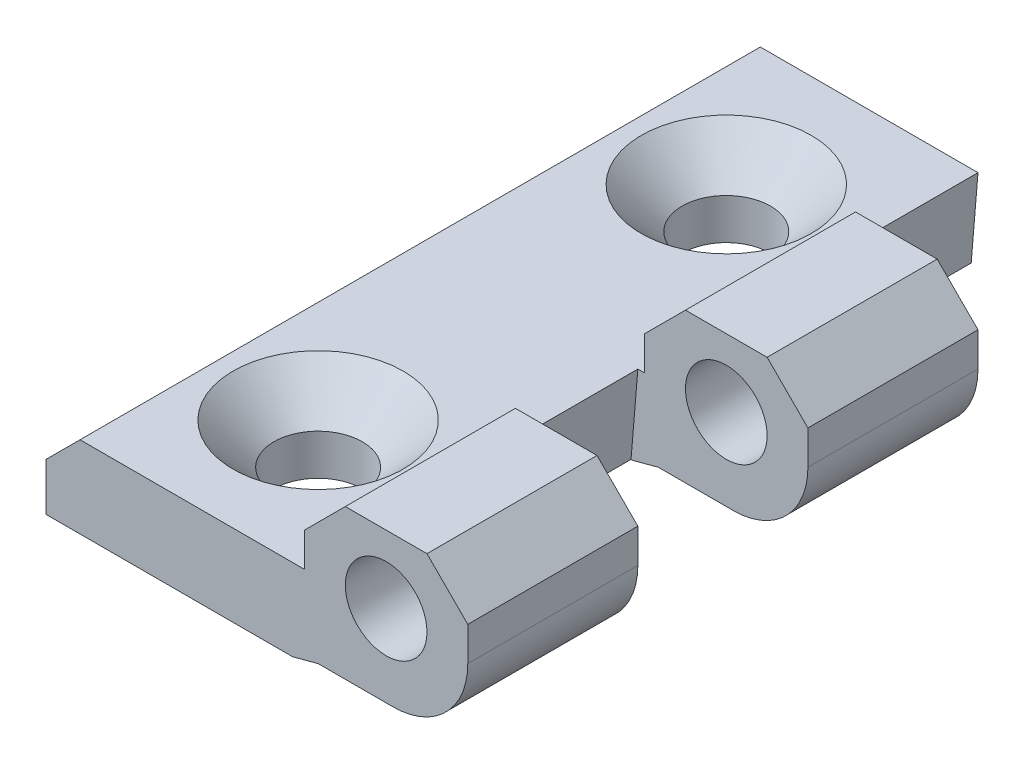
ISO-10303-21;
HEADER;
FILE_DESCRIPTION(('STEP AP214'),'2;1');
FILE_NAME('part.step','',(''),(''),'','','');
FILE_SCHEMA(('AUTOMOTIVE_DESIGN { 1 0 10303 214 1 1 1 1 }'));
ENDSEC;
DATA;
#1=APPLICATION_CONTEXT('core data for automotive mechanical design processes');
#2=APPLICATION_PROTOCOL_DEFINITION('international standard','automotive_design',2000,#1);
#3=PRODUCT_CONTEXT('',#1,'mechanical');
#4=PRODUCT('Part','Part','',(#3));
#5=PRODUCT_RELATED_PRODUCT_CATEGORY('part','',(#4));
#6=PRODUCT_DEFINITION_FORMATION('','',#4);
#7=PRODUCT_DEFINITION_CONTEXT('part definition',#1,'design');
#8=PRODUCT_DEFINITION('design','',#6,#7);
#9=PRODUCT_DEFINITION_SHAPE('','',#8);
#10=(LENGTH_UNIT() NAMED_UNIT(*) SI_UNIT(.MILLI.,.METRE.));
#11=(NAMED_UNIT(*) PLANE_ANGLE_UNIT() SI_UNIT($,.RADIAN.));
#12=(NAMED_UNIT(*) SI_UNIT($,.STERADIAN.) SOLID_ANGLE_UNIT());
#13=UNCERTAINTY_MEASURE_WITH_UNIT(LENGTH_MEASURE(1.E-05),#10,'distance_accuracy_value','');
#14=(GEOMETRIC_REPRESENTATION_CONTEXT(3) GLOBAL_UNCERTAINTY_ASSIGNED_CONTEXT((#13)) GLOBAL_UNIT_ASSIGNED_CONTEXT((#10,
#11,#12)) REPRESENTATION_CONTEXT('',''));
#15=CARTESIAN_POINT('',(0.,0.,0.));
#16=DIRECTION('',(0.,0.,1.));
#17=DIRECTION('',(1.,0.,0.));
#18=AXIS2_PLACEMENT_3D('',#15,#16,#17);
#19=CARTESIAN_POINT('',(-7.,0.,25.));
#20=DIRECTION('',(-0.99654575824488,0.0830454798537399,0.));
#21=DIRECTION('',(-0.0830454798537399,-0.99654575824488,0.));
#22=AXIS2_PLACEMENT_3D('',#19,#20,#21);
#23=PLANE('',#22);
#24=DIRECTION('',(0.08304547985374,0.99654575824488,0.));
#25=VECTOR('',#24,1.);
#26=CARTESIAN_POINT('',(-7.,0.,12.5));
#27=LINE('',#26,#25);
#28=CARTESIAN_POINT('',(-7.,0.,12.5));
#29=VERTEX_POINT('',#28);
#30=CARTESIAN_POINT('',(-6.5,6.,12.5));
#31=VERTEX_POINT('',#30);
#32=EDGE_CURVE('E207',#29,#31,#27,.T.);
#33=ORIENTED_EDGE('',*,*,#32,.F.);
#34=DIRECTION('',(0.,0.,-1.));
#35=VECTOR('',#34,1.);
#36=CARTESIAN_POINT('',(-7.,0.,12.5));
#37=LINE('',#36,#35);
#38=CARTESIAN_POINT('',(-7.,0.,0.));
#39=VERTEX_POINT('',#38);
#40=EDGE_CURVE('E195',#29,#39,#37,.T.);
#41=ORIENTED_EDGE('',*,*,#40,.T.);
#42=DIRECTION('',(0.08304547985374,0.99654575824488,0.));
#43=VECTOR('',#42,1.);
#44=CARTESIAN_POINT('',(-7.,0.,0.));
#45=LINE('',#44,#43);
#46=CARTESIAN_POINT('',(-6.5,6.,0.));
#47=VERTEX_POINT('',#46);
#48=EDGE_CURVE('E206',#39,#47,#45,.T.);
#49=ORIENTED_EDGE('',*,*,#48,.T.);
#50=DIRECTION('',(0.,0.,-1.));
#51=VECTOR('',#50,1.);
#52=CARTESIAN_POINT('',(-6.5,6.,12.5));
#53=LINE('',#52,#51);
#54=EDGE_CURVE('E220',#31,#47,#53,.T.);
#55=ORIENTED_EDGE('',*,*,#54,.F.);
#56=EDGE_LOOP('',(#33,#41,#49,#55));
#57=FACE_BOUND('',#56,.T.);
#58=ADVANCED_FACE('F24',(#57),#23,.F.);
#59=CARTESIAN_POINT('',(0.499999999999962,6.,12.5));
#60=DIRECTION('',(0.,0.,1.));
#61=DIRECTION('',(1.,0.,0.));
#62=AXIS2_PLACEMENT_3D('',#59,#60,#61);
#63=PLANE('',#62);
#64=CARTESIAN_POINT('',(0.,6.5,12.5));
#65=DIRECTION('',(0.,0.,1.));
#66=DIRECTION('',(1.,0.,0.));
#67=AXIS2_PLACEMENT_3D('',#64,#65,#66);
#68=CIRCLE('',#67,3.);
#69=CARTESIAN_POINT('',(3.,6.5,12.5));
#70=VERTEX_POINT('',#69);
#71=EDGE_CURVE('E217',#70,#70,#68,.T.);
#72=ORIENTED_EDGE('',*,*,#71,.T.);
#73=EDGE_LOOP('',(#72));
#74=FACE_BOUND('',#73,.T.);
#75=DIRECTION('',(1.,0.,0.));
#76=VECTOR('',#75,1.);
#77=CARTESIAN_POINT('',(-7.,0.,12.5));
#78=LINE('',#77,#76);
#79=CARTESIAN_POINT('',(-6.8660254037844,0.,12.5));
#80=VERTEX_POINT('',#79);
#81=EDGE_CURVE('E199',#29,#80,#78,.T.);
#82=ORIENTED_EDGE('',*,*,#81,.F.);
#83=ORIENTED_EDGE('',*,*,#32,.T.);
#84=DIRECTION('',(-1.,0.,0.));
#85=VECTOR('',#84,1.);
#86=CARTESIAN_POINT('',(-6.,6.,12.5));
#87=LINE('',#86,#85);
#88=CARTESIAN_POINT('',(-6.,6.,12.5));
#89=VERTEX_POINT('',#88);
#90=EDGE_CURVE('E216',#89,#31,#87,.T.);
#91=ORIENTED_EDGE('',*,*,#90,.F.);
#92=DIRECTION('',(0.,-1.,0.));
#93=VECTOR('',#92,1.);
#94=CARTESIAN_POINT('',(-6.,8.5,12.5));
#95=LINE('',#94,#93);
#96=CARTESIAN_POINT('',(-6.,8.5,12.5));
#97=VERTEX_POINT('',#96);
#98=EDGE_CURVE('E238',#97,#89,#95,.T.);
#99=ORIENTED_EDGE('',*,*,#98,.F.);
#100=DIRECTION('',(-0.707106781186548,-0.707106781186547,0.));
#101=VECTOR('',#100,1.);
#102=CARTESIAN_POINT('',(-3.,11.5,12.5));
#103=LINE('',#102,#101);
#104=CARTESIAN_POINT('',(-3.,11.5,12.5));
#105=VERTEX_POINT('',#104);
#106=EDGE_CURVE('E242',#105,#97,#103,.T.);
#107=ORIENTED_EDGE('',*,*,#106,.F.);
#108=DIRECTION('',(-1.,0.,0.));
#109=VECTOR('',#108,1.);
#110=CARTESIAN_POINT('',(3.,11.5,12.5));
#111=LINE('',#110,#109);
#112=CARTESIAN_POINT('',(3.,11.5,12.5));
#113=VERTEX_POINT('',#112);
#114=EDGE_CURVE('E246',#113,#105,#111,.T.);
#115=ORIENTED_EDGE('',*,*,#114,.F.);
#116=DIRECTION('',(-0.707106781186548,0.707106781186547,0.));
#117=VECTOR('',#116,1.);
#118=CARTESIAN_POINT('',(6.,8.5,12.5));
#119=LINE('',#118,#117);
#120=CARTESIAN_POINT('',(6.,8.5,12.5));
#121=VERTEX_POINT('',#120);
#122=EDGE_CURVE('E250',#121,#113,#119,.T.);
#123=ORIENTED_EDGE('',*,*,#122,.F.);
#124=DIRECTION('',(0.,1.,0.));
#125=VECTOR('',#124,1.);
#126=CARTESIAN_POINT('',(6.,6.,12.5));
#127=LINE('',#126,#125);
#128=CARTESIAN_POINT('',(6.,6.,12.5));
#129=VERTEX_POINT('',#128);
#130=EDGE_CURVE('E254',#129,#121,#127,.T.);
#131=ORIENTED_EDGE('',*,*,#130,.F.);
#132=CARTESIAN_POINT('',(0.499999999999962,6.,12.5));
#133=DIRECTION('',(0.,0.,1.));
#134=DIRECTION('',(0.,-1.,0.));
#135=AXIS2_PLACEMENT_3D('',#132,#133,#134);
#136=CIRCLE('',#135,5.5);
#137=CARTESIAN_POINT('',(0.5,0.5,12.5));
#138=VERTEX_POINT('',#137);
#139=EDGE_CURVE('E258',#138,#129,#136,.T.);
#140=ORIENTED_EDGE('',*,*,#139,.F.);
#141=DIRECTION('',(1.,0.,0.));
#142=VECTOR('',#141,1.);
#143=CARTESIAN_POINT('',(-5.,0.5,12.5));
#144=LINE('',#143,#142);
#145=CARTESIAN_POINT('',(-5.,0.5,12.5));
#146=VERTEX_POINT('',#145);
#147=EDGE_CURVE('E262',#146,#138,#144,.T.);
#148=ORIENTED_EDGE('',*,*,#147,.F.);
#149=DIRECTION('',(0.965925826289067,0.258819045102526,0.));
#150=VECTOR('',#149,1.);
#151=CARTESIAN_POINT('',(-6.8660254037844,0.,12.5));
#152=LINE('',#151,#150);
#153=EDGE_CURVE('E215',#80,#146,#152,.T.);
#154=ORIENTED_EDGE('',*,*,#153,.F.);
#155=EDGE_LOOP('',(#82,#83,#91,#99,#107,#115,#123,#131,#140,#148,#154));
#156=FACE_BOUND('',#155,.T.);
#157=ADVANCED_FACE('F212',(#74,#156),#63,.F.);
#158=CARTESIAN_POINT('',(-25.,0.,25.));
#159=DIRECTION('',(0.,1.,0.));
#160=DIRECTION('',(0.,0.,1.));
#161=AXIS2_PLACEMENT_3D('',#158,#159,#160);
#162=PLANE('',#161);
#163=CARTESIAN_POINT('',(-15.,0.,-15.));
#164=DIRECTION('',(0.,-1.,0.));
#165=DIRECTION('',(0.,0.,-1.));
#166=AXIS2_PLACEMENT_3D('',#163,#164,#165);
#167=CIRCLE('',#166,3.25);
#168=CARTESIAN_POINT('',(-15.,0.,-18.25));
#169=VERTEX_POINT('',#168);
#170=EDGE_CURVE('E269',#169,#169,#167,.T.);
#171=ORIENTED_EDGE('',*,*,#170,.F.);
#172=EDGE_LOOP('',(#171));
#173=FACE_BOUND('',#172,.T.);
#174=CARTESIAN_POINT('',(-15.,0.,15.));
#175=DIRECTION('',(0.,-1.,0.));
#176=DIRECTION('',(0.,0.,-1.));
#177=AXIS2_PLACEMENT_3D('',#174,#175,#176);
#178=CIRCLE('',#177,3.25);
#179=CARTESIAN_POINT('',(-15.,0.,11.75));
#180=VERTEX_POINT('',#179);
#181=EDGE_CURVE('E274',#180,#180,#178,.T.);
#182=ORIENTED_EDGE('',*,*,#181,.F.);
#183=EDGE_LOOP('',(#182));
#184=FACE_BOUND('',#183,.T.);
#185=DIRECTION('',(0.,0.,-1.));
#186=VECTOR('',#185,1.);
#187=CARTESIAN_POINT('',(-6.8660254037844,0.,25.));
#188=LINE('',#187,#186);
#189=CARTESIAN_POINT('',(-6.8660254037844,0.,25.));
#190=VERTEX_POINT('',#189);
#191=EDGE_CURVE('E277',#190,#80,#188,.T.);
#192=ORIENTED_EDGE('',*,*,#191,.F.);
#193=DIRECTION('',(1.,0.,0.));
#194=VECTOR('',#193,1.);
#195=CARTESIAN_POINT('',(-25.,0.,25.));
#196=LINE('',#195,#194);
#197=CARTESIAN_POINT('',(-25.,0.,25.));
#198=VERTEX_POINT('',#197);
#199=EDGE_CURVE('E279',#198,#190,#196,.T.);
#200=ORIENTED_EDGE('',*,*,#199,.F.);
#201=DIRECTION('',(0.,0.,-1.));
#202=VECTOR('',#201,1.);
#203=CARTESIAN_POINT('',(-25.,0.,25.));
#204=LINE('',#203,#202);
#205=CARTESIAN_POINT('',(-25.,0.,-25.));
#206=VERTEX_POINT('',#205);
#207=EDGE_CURVE('E283',#198,#206,#204,.T.);
#208=ORIENTED_EDGE('',*,*,#207,.T.);
#209=DIRECTION('',(1.,0.,0.));
#210=VECTOR('',#209,1.);
#211=CARTESIAN_POINT('',(-25.,0.,-25.));
#212=LINE('',#211,#210);
#213=CARTESIAN_POINT('',(-7.,0.,-25.));
#214=VERTEX_POINT('',#213);
#215=EDGE_CURVE('E288',#206,#214,#212,.T.);
#216=ORIENTED_EDGE('',*,*,#215,.T.);
#217=DIRECTION('',(0.,0.,-1.));
#218=VECTOR('',#217,1.);
#219=CARTESIAN_POINT('',(-7.,0.,-12.5));
#220=LINE('',#219,#218);
#221=CARTESIAN_POINT('',(-7.,0.,-12.5));
#222=VERTEX_POINT('',#221);
#223=EDGE_CURVE('E293',#222,#214,#220,.T.);
#224=ORIENTED_EDGE('',*,*,#223,.F.);
#225=DIRECTION('',(1.,0.,0.));
#226=VECTOR('',#225,1.);
#227=CARTESIAN_POINT('',(-7.,0.,-12.5));
#228=LINE('',#227,#226);
#229=CARTESIAN_POINT('',(-6.8660254037844,0.,-12.5));
#230=VERTEX_POINT('',#229);
#231=EDGE_CURVE('E297',#222,#230,#228,.T.);
#232=ORIENTED_EDGE('',*,*,#231,.T.);
#233=DIRECTION('',(0.,0.,1.));
#234=VECTOR('',#233,1.);
#235=CARTESIAN_POINT('',(-6.8660254037844,0.,-12.5));
#236=LINE('',#235,#234);
#237=CARTESIAN_POINT('',(-6.8660254037844,0.,0.));
#238=VERTEX_POINT('',#237);
#239=EDGE_CURVE('E302',#230,#238,#236,.T.);
#240=ORIENTED_EDGE('',*,*,#239,.T.);
#241=DIRECTION('',(1.,0.,0.));
#242=VECTOR('',#241,1.);
#243=CARTESIAN_POINT('',(-7.,0.,0.));
#244=LINE('',#243,#242);
#245=EDGE_CURVE('E202',#39,#238,#244,.T.);
#246=ORIENTED_EDGE('',*,*,#245,.F.);
#247=ORIENTED_EDGE('',*,*,#40,.F.);
#248=ORIENTED_EDGE('',*,*,#81,.T.);
#249=EDGE_LOOP('',(#192,#200,#208,#216,#224,#232,#240,#246,#247,#248));
#250=FACE_BOUND('',#249,.T.);
#251=ADVANCED_FACE('F198',(#173,#184,#250),#162,.F.);
#252=CARTESIAN_POINT('',(0.499999999999962,6.,0.));
#253=DIRECTION('',(0.,0.,1.));
#254=DIRECTION('',(1.,0.,0.));
#255=AXIS2_PLACEMENT_3D('',#252,#253,#254);
#256=PLANE('',#255);
#257=CARTESIAN_POINT('',(0.,6.5,0.));
#258=DIRECTION('',(0.,0.,1.));
#259=DIRECTION('',(1.,0.,0.));
#260=AXIS2_PLACEMENT_3D('',#257,#258,#259);
#261=CIRCLE('',#260,3.);
#262=CARTESIAN_POINT('',(3.,6.5,0.));
#263=VERTEX_POINT('',#262);
#264=EDGE_CURVE('E309',#263,#263,#261,.T.);
#265=ORIENTED_EDGE('',*,*,#264,.F.);
#266=EDGE_LOOP('',(#265));
#267=FACE_BOUND('',#266,.T.);
#268=ORIENTED_EDGE('',*,*,#48,.F.);
#269=ORIENTED_EDGE('',*,*,#245,.T.);
#270=DIRECTION('',(0.965925826289067,0.258819045102526,0.));
#271=VECTOR('',#270,1.);
#272=CARTESIAN_POINT('',(-6.8660254037844,0.,0.));
#273=LINE('',#272,#271);
#274=CARTESIAN_POINT('',(-5.,0.5,0.));
#275=VERTEX_POINT('',#274);
#276=EDGE_CURVE('E314',#238,#275,#273,.T.);
#277=ORIENTED_EDGE('',*,*,#276,.T.);
#278=DIRECTION('',(1.,0.,0.));
#279=VECTOR('',#278,1.);
#280=CARTESIAN_POINT('',(-5.,0.5,0.));
#281=LINE('',#280,#279);
#282=CARTESIAN_POINT('',(0.5,0.5,0.));
#283=VERTEX_POINT('',#282);
#284=EDGE_CURVE('E317',#275,#283,#281,.T.);
#285=ORIENTED_EDGE('',*,*,#284,.T.);
#286=CARTESIAN_POINT('',(0.499999999999962,6.,0.));
#287=DIRECTION('',(0.,0.,1.));
#288=DIRECTION('',(0.,-1.,0.));
#289=AXIS2_PLACEMENT_3D('',#286,#287,#288);
#290=CIRCLE('',#289,5.5);
#291=CARTESIAN_POINT('',(6.,6.,0.));
#292=VERTEX_POINT('',#291);
#293=EDGE_CURVE('E322',#283,#292,#290,.T.);
#294=ORIENTED_EDGE('',*,*,#293,.T.);
#295=DIRECTION('',(0.,1.,0.));
#296=VECTOR('',#295,1.);
#297=CARTESIAN_POINT('',(6.,6.,0.));
#298=LINE('',#297,#296);
#299=CARTESIAN_POINT('',(6.,8.5,0.));
#300=VERTEX_POINT('',#299);
#301=EDGE_CURVE('E327',#292,#300,#298,.T.);
#302=ORIENTED_EDGE('',*,*,#301,.T.);
#303=DIRECTION('',(-0.707106781186548,0.707106781186547,0.));
#304=VECTOR('',#303,1.);
#305=CARTESIAN_POINT('',(6.,8.5,0.));
#306=LINE('',#305,#304);
#307=CARTESIAN_POINT('',(3.,11.5,0.));
#308=VERTEX_POINT('',#307);
#309=EDGE_CURVE('E332',#300,#308,#306,.T.);
#310=ORIENTED_EDGE('',*,*,#309,.T.);
#311=DIRECTION('',(-1.,0.,0.));
#312=VECTOR('',#311,1.);
#313=CARTESIAN_POINT('',(3.,11.5,0.));
#314=LINE('',#313,#312);
#315=CARTESIAN_POINT('',(-3.,11.5,0.));
#316=VERTEX_POINT('',#315);
#317=EDGE_CURVE('E337',#308,#316,#314,.T.);
#318=ORIENTED_EDGE('',*,*,#317,.T.);
#319=DIRECTION('',(-0.707106781186548,-0.707106781186547,0.));
#320=VECTOR('',#319,1.);
#321=CARTESIAN_POINT('',(-3.,11.5,0.));
#322=LINE('',#321,#320);
#323=CARTESIAN_POINT('',(-6.,8.5,0.));
#324=VERTEX_POINT('',#323);
#325=EDGE_CURVE('E342',#316,#324,#322,.T.);
#326=ORIENTED_EDGE('',*,*,#325,.T.);
#327=DIRECTION('',(0.,-1.,0.));
#328=VECTOR('',#327,1.);
#329=CARTESIAN_POINT('',(-6.,8.5,0.));
#330=LINE('',#329,#328);
#331=CARTESIAN_POINT('',(-6.,6.,0.));
#332=VERTEX_POINT('',#331);
#333=EDGE_CURVE('E347',#324,#332,#330,.T.);
#334=ORIENTED_EDGE('',*,*,#333,.T.);
#335=DIRECTION('',(-1.,0.,0.));
#336=VECTOR('',#335,1.);
#337=CARTESIAN_POINT('',(-6.,6.,0.));
#338=LINE('',#337,#336);
#339=EDGE_CURVE('E352',#332,#47,#338,.T.);
#340=ORIENTED_EDGE('',*,*,#339,.T.);
#341=EDGE_LOOP('',(#268,#269,#277,#285,#294,#302,#310,#318,#326,#334,#340));
#342=FACE_BOUND('',#341,.T.);
#343=ADVANCED_FACE('F576',(#267,#342),#256,.T.);
#344=CARTESIAN_POINT('',(-6.5,6.,25.));
#345=DIRECTION('',(0.,-1.,0.));
#346=DIRECTION('',(0.,0.,-1.));
#347=AXIS2_PLACEMENT_3D('',#344,#345,#346);
#348=PLANE('',#347);
#349=CARTESIAN_POINT('',(-15.,6.,-15.));
#350=DIRECTION('',(0.,-1.,0.));
#351=DIRECTION('',(0.,0.,-1.));
#352=AXIS2_PLACEMENT_3D('',#349,#350,#351);
#353=CIRCLE('',#352,6.25);
#354=CARTESIAN_POINT('',(-15.,6.,-21.25));
#355=VERTEX_POINT('',#354);
#356=EDGE_CURVE('E357',#355,#355,#353,.T.);
#357=ORIENTED_EDGE('',*,*,#356,.T.);
#358=EDGE_LOOP('',(#357));
#359=FACE_BOUND('',#358,.T.);
#360=CARTESIAN_POINT('',(-15.,6.,15.));
#361=DIRECTION('',(0.,-1.,0.));
#362=DIRECTION('',(0.,0.,-1.));
#363=AXIS2_PLACEMENT_3D('',#360,#361,#362);
#364=CIRCLE('',#363,6.25);
#365=CARTESIAN_POINT('',(-15.,6.,8.75));
#366=VERTEX_POINT('',#365);
#367=EDGE_CURVE('E362',#366,#366,#364,.T.);
#368=ORIENTED_EDGE('',*,*,#367,.T.);
#369=EDGE_LOOP('',(#368));
#370=FACE_BOUND('',#369,.T.);
#371=DIRECTION('',(0.,0.,-1.));
#372=VECTOR('',#371,1.);
#373=CARTESIAN_POINT('',(-22.5,6.,25.));
#374=LINE('',#373,#372);
#375=CARTESIAN_POINT('',(-22.5,6.,25.));
#376=VERTEX_POINT('',#375);
#377=CARTESIAN_POINT('',(-22.5,6.,-25.));
#378=VERTEX_POINT('',#377);
#379=EDGE_CURVE('E365',#376,#378,#374,.T.);
#380=ORIENTED_EDGE('',*,*,#379,.F.);
#381=DIRECTION('',(-1.,0.,0.));
#382=VECTOR('',#381,1.);
#383=CARTESIAN_POINT('',(-6.,6.,25.));
#384=LINE('',#383,#382);
#385=CARTESIAN_POINT('',(-6.,6.,25.));
#386=VERTEX_POINT('',#385);
#387=EDGE_CURVE('E367',#386,#376,#384,.T.);
#388=ORIENTED_EDGE('',*,*,#387,.F.);
#389=DIRECTION('',(0.,0.,-1.));
#390=VECTOR('',#389,1.);
#391=CARTESIAN_POINT('',(-6.,6.,25.));
#392=LINE('',#391,#390);
#393=EDGE_CURVE('E372',#386,#89,#392,.T.);
#394=ORIENTED_EDGE('',*,*,#393,.T.);
#395=ORIENTED_EDGE('',*,*,#90,.T.);
#396=ORIENTED_EDGE('',*,*,#54,.T.);
#397=ORIENTED_EDGE('',*,*,#339,.F.);
#398=DIRECTION('',(0.,0.,1.));
#399=VECTOR('',#398,1.);
#400=CARTESIAN_POINT('',(-6.,6.,-12.5));
#401=LINE('',#400,#399);
#402=CARTESIAN_POINT('',(-6.,6.,-12.5));
#403=VERTEX_POINT('',#402);
#404=EDGE_CURVE('E377',#403,#332,#401,.T.);
#405=ORIENTED_EDGE('',*,*,#404,.F.);
#406=DIRECTION('',(-1.,0.,0.));
#407=VECTOR('',#406,1.);
#408=CARTESIAN_POINT('',(-6.,6.,-12.5));
#409=LINE('',#408,#407);
#410=CARTESIAN_POINT('',(-6.5,6.,-12.5));
#411=VERTEX_POINT('',#410);
#412=EDGE_CURVE('E381',#403,#411,#409,.T.);
#413=ORIENTED_EDGE('',*,*,#412,.T.);
#414=DIRECTION('',(0.,0.,-1.));
#415=VECTOR('',#414,1.);
#416=CARTESIAN_POINT('',(-6.5,6.,-12.5));
#417=LINE('',#416,#415);
#418=CARTESIAN_POINT('',(-6.5,6.,-25.));
#419=VERTEX_POINT('',#418);
#420=EDGE_CURVE('E386',#411,#419,#417,.T.);
#421=ORIENTED_EDGE('',*,*,#420,.T.);
#422=DIRECTION('',(-1.,0.,0.));
#423=VECTOR('',#422,1.);
#424=CARTESIAN_POINT('',(-6.5,6.,-25.));
#425=LINE('',#424,#423);
#426=EDGE_CURVE('E391',#419,#378,#425,.T.);
#427=ORIENTED_EDGE('',*,*,#426,.T.);
#428=EDGE_LOOP('',(#380,#388,#394,#395,#396,#397,#405,#413,#421,#427));
#429=FACE_BOUND('',#428,.T.);
#430=ADVANCED_FACE('F603',(#359,#370,#429),#348,.F.);
#431=CARTESIAN_POINT('',(0.,6.5,25.));
#432=DIRECTION('',(0.,0.,-1.));
#433=DIRECTION('',(-1.,0.,0.));
#434=AXIS2_PLACEMENT_3D('',#431,#432,#433);
#435=CYLINDRICAL_SURFACE('',#434,3.);
#436=CARTESIAN_POINT('',(0.,6.5,25.));
#437=DIRECTION('',(0.,0.,1.));
#438=DIRECTION('',(1.,0.,0.));
#439=AXIS2_PLACEMENT_3D('',#436,#437,#438);
#440=CIRCLE('',#439,3.);
#441=CARTESIAN_POINT('',(3.,6.5,25.));
#442=VERTEX_POINT('',#441);
#443=EDGE_CURVE('E396',#442,#442,#440,.T.);
#444=ORIENTED_EDGE('',*,*,#443,.T.);
#445=EDGE_LOOP('',(#444));
#446=FACE_BOUND('',#445,.T.);
#447=ORIENTED_EDGE('',*,*,#71,.F.);
#448=EDGE_LOOP('',(#447));
#449=FACE_BOUND('',#448,.T.);
#450=ADVANCED_FACE('F717',(#446,#449),#435,.F.);
#451=CARTESIAN_POINT('',(-6.,8.5,25.));
#452=DIRECTION('',(1.,0.,0.));
#453=DIRECTION('',(0.,0.,-1.));
#454=AXIS2_PLACEMENT_3D('',#451,#452,#453);
#455=PLANE('',#454);
#456=ORIENTED_EDGE('',*,*,#98,.T.);
#457=ORIENTED_EDGE('',*,*,#393,.F.);
#458=DIRECTION('',(0.,-1.,0.));
#459=VECTOR('',#458,1.);
#460=CARTESIAN_POINT('',(-6.,8.5,25.));
#461=LINE('',#460,#459);
#462=CARTESIAN_POINT('',(-6.,8.5,25.));
#463=VERTEX_POINT('',#462);
#464=EDGE_CURVE('E401',#463,#386,#461,.T.);
#465=ORIENTED_EDGE('',*,*,#464,.F.);
#466=DIRECTION('',(0.,0.,-1.));
#467=VECTOR('',#466,1.);
#468=CARTESIAN_POINT('',(-6.,8.5,25.));
#469=LINE('',#468,#467);
#470=EDGE_CURVE('E403',#463,#97,#469,.T.);
#471=ORIENTED_EDGE('',*,*,#470,.T.);
#472=EDGE_LOOP('',(#456,#457,#465,#471));
#473=FACE_BOUND('',#472,.T.);
#474=ADVANCED_FACE('F617',(#473),#455,.F.);
#475=CARTESIAN_POINT('',(-3.,11.5,25.));
#476=DIRECTION('',(0.707106781186547,-0.707106781186548,0.));
#477=DIRECTION('',(0.707106781186548,0.707106781186547,0.));
#478=AXIS2_PLACEMENT_3D('',#475,#476,#477);
#479=PLANE('',#478);
#480=ORIENTED_EDGE('',*,*,#106,.T.);
#481=ORIENTED_EDGE('',*,*,#470,.F.);
#482=DIRECTION('',(-0.707106781186548,-0.707106781186547,0.));
#483=VECTOR('',#482,1.);
#484=CARTESIAN_POINT('',(-3.,11.5,25.));
#485=LINE('',#484,#483);
#486=CARTESIAN_POINT('',(-3.,11.5,25.));
#487=VERTEX_POINT('',#486);
#488=EDGE_CURVE('E408',#487,#463,#485,.T.);
#489=ORIENTED_EDGE('',*,*,#488,.F.);
#490=DIRECTION('',(0.,0.,-1.));
#491=VECTOR('',#490,1.);
#492=CARTESIAN_POINT('',(-3.,11.5,25.));
#493=LINE('',#492,#491);
#494=EDGE_CURVE('E412',#487,#105,#493,.T.);
#495=ORIENTED_EDGE('',*,*,#494,.T.);
#496=EDGE_LOOP('',(#480,#481,#489,#495));
#497=FACE_BOUND('',#496,.T.);
#498=ADVANCED_FACE('F622',(#497),#479,.F.);
#499=CARTESIAN_POINT('',(3.,11.5,25.));
#500=DIRECTION('',(0.,-1.,0.));
#501=DIRECTION('',(0.,0.,-1.));
#502=AXIS2_PLACEMENT_3D('',#499,#500,#501);
#503=PLANE('',#502);
#504=ORIENTED_EDGE('',*,*,#114,.T.);
#505=ORIENTED_EDGE('',*,*,#494,.F.);
#506=DIRECTION('',(-1.,0.,0.));
#507=VECTOR('',#506,1.);
#508=CARTESIAN_POINT('',(3.,11.5,25.));
#509=LINE('',#508,#507);
#510=CARTESIAN_POINT('',(3.,11.5,25.));
#511=VERTEX_POINT('',#510);
#512=EDGE_CURVE('E417',#511,#487,#509,.T.);
#513=ORIENTED_EDGE('',*,*,#512,.F.);
#514=DIRECTION('',(0.,0.,-1.));
#515=VECTOR('',#514,1.);
#516=CARTESIAN_POINT('',(3.,11.5,25.));
#517=LINE('',#516,#515);
#518=EDGE_CURVE('E421',#511,#113,#517,.T.);
#519=ORIENTED_EDGE('',*,*,#518,.T.);
#520=EDGE_LOOP('',(#504,#505,#513,#519));
#521=FACE_BOUND('',#520,.T.);
#522=ADVANCED_FACE('F626',(#521),#503,.F.);
#523=CARTESIAN_POINT('',(6.,8.5,25.));
#524=DIRECTION('',(-0.707106781186547,-0.707106781186548,0.));
#525=DIRECTION('',(0.707106781186548,-0.707106781186547,0.));
#526=AXIS2_PLACEMENT_3D('',#523,#524,#525);
#527=PLANE('',#526);
#528=ORIENTED_EDGE('',*,*,#122,.T.);
#529=ORIENTED_EDGE('',*,*,#518,.F.);
#530=DIRECTION('',(-0.707106781186548,0.707106781186547,0.));
#531=VECTOR('',#530,1.);
#532=CARTESIAN_POINT('',(6.,8.5,25.));
#533=LINE('',#532,#531);
#534=CARTESIAN_POINT('',(6.,8.5,25.));
#535=VERTEX_POINT('',#534);
#536=EDGE_CURVE('E426',#535,#511,#533,.T.);
#537=ORIENTED_EDGE('',*,*,#536,.F.);
#538=DIRECTION('',(0.,0.,-1.));
#539=VECTOR('',#538,1.);
#540=CARTESIAN_POINT('',(6.,8.5,25.));
#541=LINE('',#540,#539);
#542=EDGE_CURVE('E430',#535,#121,#541,.T.);
#543=ORIENTED_EDGE('',*,*,#542,.T.);
#544=EDGE_LOOP('',(#528,#529,#537,#543));
#545=FACE_BOUND('',#544,.T.);
#546=ADVANCED_FACE('F632',(#545),#527,.F.);
#547=CARTESIAN_POINT('',(6.,6.,25.));
#548=DIRECTION('',(-1.,0.,0.));
#549=DIRECTION('',(0.,0.,1.));
#550=AXIS2_PLACEMENT_3D('',#547,#548,#549);
#551=PLANE('',#550);
#552=ORIENTED_EDGE('',*,*,#130,.T.);
#553=ORIENTED_EDGE('',*,*,#542,.F.);
#554=DIRECTION('',(0.,1.,0.));
#555=VECTOR('',#554,1.);
#556=CARTESIAN_POINT('',(6.,6.,25.));
#557=LINE('',#556,#555);
#558=CARTESIAN_POINT('',(6.,6.,25.));
#559=VERTEX_POINT('',#558);
#560=EDGE_CURVE('E435',#559,#535,#557,.T.);
#561=ORIENTED_EDGE('',*,*,#560,.F.);
#562=DIRECTION('',(0.,0.,-1.));
#563=VECTOR('',#562,1.);
#564=CARTESIAN_POINT('',(6.,6.,25.));
#565=LINE('',#564,#563);
#566=EDGE_CURVE('E439',#559,#129,#565,.T.);
#567=ORIENTED_EDGE('',*,*,#566,.T.);
#568=EDGE_LOOP('',(#552,#553,#561,#567));
#569=FACE_BOUND('',#568,.T.);
#570=ADVANCED_FACE('F637',(#569),#551,.F.);
#571=CARTESIAN_POINT('',(0.499999999999962,6.,25.));
#572=DIRECTION('',(0.,0.,-1.));
#573=DIRECTION('',(-1.,0.,0.));
#574=AXIS2_PLACEMENT_3D('',#571,#572,#573);
#575=CYLINDRICAL_SURFACE('',#574,5.5);
#576=ORIENTED_EDGE('',*,*,#139,.T.);
#577=ORIENTED_EDGE('',*,*,#566,.F.);
#578=CARTESIAN_POINT('',(0.499999999999962,6.,25.));
#579=DIRECTION('',(0.,0.,1.));
#580=DIRECTION('',(0.,-1.,0.));
#581=AXIS2_PLACEMENT_3D('',#578,#579,#580);
#582=CIRCLE('',#581,5.5);
#583=CARTESIAN_POINT('',(0.5,0.5,25.));
#584=VERTEX_POINT('',#583);
#585=EDGE_CURVE('E444',#584,#559,#582,.T.);
#586=ORIENTED_EDGE('',*,*,#585,.F.);
#587=DIRECTION('',(0.,0.,-1.));
#588=VECTOR('',#587,1.);
#589=CARTESIAN_POINT('',(0.5,0.5,25.));
#590=LINE('',#589,#588);
#591=EDGE_CURVE('E448',#584,#138,#590,.T.);
#592=ORIENTED_EDGE('',*,*,#591,.T.);
#593=EDGE_LOOP('',(#576,#577,#586,#592));
#594=FACE_BOUND('',#593,.T.);
#595=ADVANCED_FACE('F641',(#594),#575,.T.);
#596=CARTESIAN_POINT('',(-5.,0.5,25.));
#597=DIRECTION('',(0.,1.,0.));
#598=DIRECTION('',(0.,0.,1.));
#599=AXIS2_PLACEMENT_3D('',#596,#597,#598);
#600=PLANE('',#599);
#601=ORIENTED_EDGE('',*,*,#147,.T.);
#602=ORIENTED_EDGE('',*,*,#591,.F.);
#603=DIRECTION('',(1.,0.,0.));
#604=VECTOR('',#603,1.);
#605=CARTESIAN_POINT('',(-5.,0.5,25.));
#606=LINE('',#605,#604);
#607=CARTESIAN_POINT('',(-5.,0.5,25.));
#608=VERTEX_POINT('',#607);
#609=EDGE_CURVE('E453',#608,#584,#606,.T.);
#610=ORIENTED_EDGE('',*,*,#609,.F.);
#611=DIRECTION('',(0.,0.,-1.));
#612=VECTOR('',#611,1.);
#613=CARTESIAN_POINT('',(-5.,0.5,25.));
#614=LINE('',#613,#612);
#615=EDGE_CURVE('E457',#608,#146,#614,.T.);
#616=ORIENTED_EDGE('',*,*,#615,.T.);
#617=EDGE_LOOP('',(#601,#602,#610,#616));
#618=FACE_BOUND('',#617,.T.);
#619=ADVANCED_FACE('F644',(#618),#600,.F.);
#620=CARTESIAN_POINT('',(-6.8660254037844,0.,25.));
#621=DIRECTION('',(-0.258819045102526,0.965925826289067,0.));
#622=DIRECTION('',(-0.965925826289067,-0.258819045102526,0.));
#623=AXIS2_PLACEMENT_3D('',#620,#621,#622);
#624=PLANE('',#623);
#625=ORIENTED_EDGE('',*,*,#153,.T.);
#626=ORIENTED_EDGE('',*,*,#615,.F.);
#627=DIRECTION('',(0.965925826289067,0.258819045102526,0.));
#628=VECTOR('',#627,1.);
#629=CARTESIAN_POINT('',(-6.8660254037844,0.,25.));
#630=LINE('',#629,#628);
#631=EDGE_CURVE('E462',#190,#608,#630,.T.);
#632=ORIENTED_EDGE('',*,*,#631,.F.);
#633=ORIENTED_EDGE('',*,*,#191,.T.);
#634=EDGE_LOOP('',(#625,#626,#632,#633));
#635=FACE_BOUND('',#634,.T.);
#636=ADVANCED_FACE('F649',(#635),#624,.F.);
#637=CARTESIAN_POINT('',(-15.,0.,-15.));
#638=DIRECTION('',(0.,-1.,0.));
#639=DIRECTION('',(0.,0.,-1.));
#640=AXIS2_PLACEMENT_3D('',#637,#638,#639);
#641=CYLINDRICAL_SURFACE('',#640,3.25);
#642=ORIENTED_EDGE('',*,*,#170,.T.);
#643=EDGE_LOOP('',(#642));
#644=FACE_BOUND('',#643,.T.);
#645=CARTESIAN_POINT('',(-15.,3.,-15.));
#646=DIRECTION('',(0.,-1.,0.));
#647=DIRECTION('',(0.,0.,-1.));
#648=AXIS2_PLACEMENT_3D('',#645,#646,#647);
#649=CIRCLE('',#648,3.25);
#650=CARTESIAN_POINT('',(-15.,3.,-18.25));
#651=VERTEX_POINT('',#650);
#652=EDGE_CURVE('E466',#651,#651,#649,.T.);
#653=ORIENTED_EDGE('',*,*,#652,.F.);
#654=EDGE_LOOP('',(#653));
#655=FACE_BOUND('',#654,.T.);
#656=ADVANCED_FACE('F747',(#644,#655),#641,.F.);
#657=CARTESIAN_POINT('',(-15.,0.,15.));
#658=DIRECTION('',(0.,-1.,0.));
#659=DIRECTION('',(0.,0.,-1.));
#660=AXIS2_PLACEMENT_3D('',#657,#658,#659);
#661=CYLINDRICAL_SURFACE('',#660,3.25);
#662=ORIENTED_EDGE('',*,*,#181,.T.);
#663=EDGE_LOOP('',(#662));
#664=FACE_BOUND('',#663,.T.);
#665=CARTESIAN_POINT('',(-15.,3.,15.));
#666=DIRECTION('',(0.,-1.,0.));
#667=DIRECTION('',(0.,0.,-1.));
#668=AXIS2_PLACEMENT_3D('',#665,#666,#667);
#669=CIRCLE('',#668,3.25);
#670=CARTESIAN_POINT('',(-15.,3.,11.75));
#671=VERTEX_POINT('',#670);
#672=EDGE_CURVE('E471',#671,#671,#669,.T.);
#673=ORIENTED_EDGE('',*,*,#672,.F.);
#674=EDGE_LOOP('',(#673));
#675=FACE_BOUND('',#674,.T.);
#676=ADVANCED_FACE('F750',(#664,#675),#661,.F.);
#677=CARTESIAN_POINT('',(0.,0.,25.));
#678=DIRECTION('',(0.,0.,1.));
#679=DIRECTION('',(1.,0.,0.));
#680=AXIS2_PLACEMENT_3D('',#677,#678,#679);
#681=PLANE('',#680);
#682=ORIENTED_EDGE('',*,*,#387,.T.);
#683=DIRECTION('',(-0.707106781186548,-0.707106781186547,0.));
#684=VECTOR('',#683,1.);
#685=CARTESIAN_POINT('',(-22.5,6.,25.));
#686=LINE('',#685,#684);
#687=CARTESIAN_POINT('',(-25.,3.5,25.));
#688=VERTEX_POINT('',#687);
#689=EDGE_CURVE('E474',#376,#688,#686,.T.);
#690=ORIENTED_EDGE('',*,*,#689,.T.);
#691=DIRECTION('',(0.,-1.,0.));
#692=VECTOR('',#691,1.);
#693=CARTESIAN_POINT('',(-25.,3.5,25.));
#694=LINE('',#693,#692);
#695=EDGE_CURVE('E477',#688,#198,#694,.T.);
#696=ORIENTED_EDGE('',*,*,#695,.T.);
#697=ORIENTED_EDGE('',*,*,#199,.T.);
#698=ORIENTED_EDGE('',*,*,#631,.T.);
#699=ORIENTED_EDGE('',*,*,#609,.T.);
#700=ORIENTED_EDGE('',*,*,#585,.T.);
#701=ORIENTED_EDGE('',*,*,#560,.T.);
#702=ORIENTED_EDGE('',*,*,#536,.T.);
#703=ORIENTED_EDGE('',*,*,#512,.T.);
#704=ORIENTED_EDGE('',*,*,#488,.T.);
#705=ORIENTED_EDGE('',*,*,#464,.T.);
#706=EDGE_LOOP('',(#682,#690,#696,#697,#698,#699,#700,#701,#702,#703,#704,#705));
#707=FACE_BOUND('',#706,.T.);
#708=ORIENTED_EDGE('',*,*,#443,.F.);
#709=EDGE_LOOP('',(#708));
#710=FACE_BOUND('',#709,.T.);
#711=ADVANCED_FACE('F652',(#707,#710),#681,.T.);
#712=CARTESIAN_POINT('',(-25.,3.5,25.));
#713=DIRECTION('',(1.,0.,0.));
#714=DIRECTION('',(0.,0.,-1.));
#715=AXIS2_PLACEMENT_3D('',#712,#713,#714);
#716=PLANE('',#715);
#717=DIRECTION('',(0.,-1.,0.));
#718=VECTOR('',#717,1.);
#719=CARTESIAN_POINT('',(-25.,3.5,-25.));
#720=LINE('',#719,#718);
#721=CARTESIAN_POINT('',(-25.,3.5,-25.));
#722=VERTEX_POINT('',#721);
#723=EDGE_CURVE('E482',#722,#206,#720,.T.);
#724=ORIENTED_EDGE('',*,*,#723,.T.);
#725=ORIENTED_EDGE('',*,*,#207,.F.);
#726=ORIENTED_EDGE('',*,*,#695,.F.);
#727=DIRECTION('',(0.,0.,-1.));
#728=VECTOR('',#727,1.);
#729=CARTESIAN_POINT('',(-25.,3.5,25.));
#730=LINE('',#729,#728);
#731=EDGE_CURVE('E487',#688,#722,#730,.T.);
#732=ORIENTED_EDGE('',*,*,#731,.T.);
#733=EDGE_LOOP('',(#724,#725,#726,#732));
#734=FACE_BOUND('',#733,.T.);
#735=ADVANCED_FACE('F656',(#734),#716,.F.);
#736=CARTESIAN_POINT('',(0.,0.,-25.));
#737=DIRECTION('',(0.,0.,1.));
#738=DIRECTION('',(1.,0.,0.));
#739=AXIS2_PLACEMENT_3D('',#736,#737,#738);
#740=PLANE('',#739);
#741=DIRECTION('',(-0.707106781186548,-0.707106781186547,0.));
#742=VECTOR('',#741,1.);
#743=CARTESIAN_POINT('',(-22.5,6.,-25.));
#744=LINE('',#743,#742);
#745=EDGE_CURVE('E492',#378,#722,#744,.T.);
#746=ORIENTED_EDGE('',*,*,#745,.F.);
#747=ORIENTED_EDGE('',*,*,#426,.F.);
#748=DIRECTION('',(0.08304547985374,0.99654575824488,0.));
#749=VECTOR('',#748,1.);
#750=CARTESIAN_POINT('',(-7.,0.,-25.));
#751=LINE('',#750,#749);
#752=EDGE_CURVE('E496',#214,#419,#751,.T.);
#753=ORIENTED_EDGE('',*,*,#752,.F.);
#754=ORIENTED_EDGE('',*,*,#215,.F.);
#755=ORIENTED_EDGE('',*,*,#723,.F.);
#756=EDGE_LOOP('',(#746,#747,#753,#754,#755));
#757=FACE_BOUND('',#756,.T.);
#758=ADVANCED_FACE('F599',(#757),#740,.F.);
#759=DIRECTION('',(0.08304547985374,0.99654575824488,0.));
#760=VECTOR('',#759,1.);
#761=CARTESIAN_POINT('',(-7.,0.,-12.5));
#762=LINE('',#761,#760);
#763=EDGE_CURVE('E500',#222,#411,#762,.T.);
#764=ORIENTED_EDGE('',*,*,#763,.F.);
#765=ORIENTED_EDGE('',*,*,#223,.T.);
#766=ORIENTED_EDGE('',*,*,#752,.T.);
#767=ORIENTED_EDGE('',*,*,#420,.F.);
#768=EDGE_LOOP('',(#764,#765,#766,#767));
#769=FACE_BOUND('',#768,.T.);
#770=ADVANCED_FACE('F594',(#769),#23,.F.);
#771=CARTESIAN_POINT('',(0.499999999999962,6.,-12.5));
#772=DIRECTION('',(0.,0.,1.));
#773=DIRECTION('',(1.,0.,0.));
#774=AXIS2_PLACEMENT_3D('',#771,#772,#773);
#775=PLANE('',#774);
#776=CARTESIAN_POINT('',(0.,6.5,-12.5));
#777=DIRECTION('',(0.,0.,1.));
#778=DIRECTION('',(1.,0.,0.));
#779=AXIS2_PLACEMENT_3D('',#776,#777,#778);
#780=CIRCLE('',#779,3.);
#781=CARTESIAN_POINT('',(3.,6.5,-12.5));
#782=VERTEX_POINT('',#781);
#783=EDGE_CURVE('E504',#782,#782,#780,.T.);
#784=ORIENTED_EDGE('',*,*,#783,.T.);
#785=EDGE_LOOP('',(#784));
#786=FACE_BOUND('',#785,.T.);
#787=ORIENTED_EDGE('',*,*,#231,.F.);
#788=ORIENTED_EDGE('',*,*,#763,.T.);
#789=ORIENTED_EDGE('',*,*,#412,.F.);
#790=DIRECTION('',(0.,-1.,0.));
#791=VECTOR('',#790,1.);
#792=CARTESIAN_POINT('',(-6.,8.5,-12.5));
#793=LINE('',#792,#791);
#794=CARTESIAN_POINT('',(-6.,8.5,-12.5));
#795=VERTEX_POINT('',#794);
#796=EDGE_CURVE('E509',#795,#403,#793,.T.);
#797=ORIENTED_EDGE('',*,*,#796,.F.);
#798=DIRECTION('',(-0.707106781186548,-0.707106781186547,0.));
#799=VECTOR('',#798,1.);
#800=CARTESIAN_POINT('',(-3.,11.5,-12.5));
#801=LINE('',#800,#799);
#802=CARTESIAN_POINT('',(-3.,11.5,-12.5));
#803=VERTEX_POINT('',#802);
#804=EDGE_CURVE('E511',#803,#795,#801,.T.);
#805=ORIENTED_EDGE('',*,*,#804,.F.);
#806=DIRECTION('',(-1.,0.,0.));
#807=VECTOR('',#806,1.);
#808=CARTESIAN_POINT('',(3.,11.5,-12.5));
#809=LINE('',#808,#807);
#810=CARTESIAN_POINT('',(3.,11.5,-12.5));
#811=VERTEX_POINT('',#810);
#812=EDGE_CURVE('E516',#811,#803,#809,.T.);
#813=ORIENTED_EDGE('',*,*,#812,.F.);
#814=DIRECTION('',(-0.707106781186548,0.707106781186547,0.));
#815=VECTOR('',#814,1.);
#816=CARTESIAN_POINT('',(6.,8.5,-12.5));
#817=LINE('',#816,#815);
#818=CARTESIAN_POINT('',(6.,8.5,-12.5));
#819=VERTEX_POINT('',#818);
#820=EDGE_CURVE('E521',#819,#811,#817,.T.);
#821=ORIENTED_EDGE('',*,*,#820,.F.);
#822=DIRECTION('',(0.,1.,0.));
#823=VECTOR('',#822,1.);
#824=CARTESIAN_POINT('',(6.,6.,-12.5));
#825=LINE('',#824,#823);
#826=CARTESIAN_POINT('',(6.,6.,-12.5));
#827=VERTEX_POINT('',#826);
#828=EDGE_CURVE('E526',#827,#819,#825,.T.);
#829=ORIENTED_EDGE('',*,*,#828,.F.);
#830=CARTESIAN_POINT('',(0.499999999999962,6.,-12.5));
#831=DIRECTION('',(0.,0.,1.));
#832=DIRECTION('',(0.,-1.,0.));
#833=AXIS2_PLACEMENT_3D('',#830,#831,#832);
#834=CIRCLE('',#833,5.5);
#835=CARTESIAN_POINT('',(0.5,0.5,-12.5));
#836=VERTEX_POINT('',#835);
#837=EDGE_CURVE('E531',#836,#827,#834,.T.);
#838=ORIENTED_EDGE('',*,*,#837,.F.);
#839=DIRECTION('',(1.,0.,0.));
#840=VECTOR('',#839,1.);
#841=CARTESIAN_POINT('',(-5.,0.5,-12.5));
#842=LINE('',#841,#840);
#843=CARTESIAN_POINT('',(-5.,0.5,-12.5));
#844=VERTEX_POINT('',#843);
#845=EDGE_CURVE('E535',#844,#836,#842,.T.);
#846=ORIENTED_EDGE('',*,*,#845,.F.);
#847=DIRECTION('',(0.965925826289067,0.258819045102526,0.));
#848=VECTOR('',#847,1.);
#849=CARTESIAN_POINT('',(-6.8660254037844,0.,-12.5));
#850=LINE('',#849,#848);
#851=EDGE_CURVE('E539',#230,#844,#850,.T.);
#852=ORIENTED_EDGE('',*,*,#851,.F.);
#853=EDGE_LOOP('',(#787,#788,#789,#797,#805,#813,#821,#829,#838,#846,#852));
#854=FACE_BOUND('',#853,.T.);
#855=ADVANCED_FACE('F584',(#786,#854),#775,.F.);
#856=CARTESIAN_POINT('',(-6.8660254037844,0.,-12.5));
#857=DIRECTION('',(0.258819045102526,-0.965925826289067,0.));
#858=DIRECTION('',(0.965925826289067,0.258819045102526,0.));
#859=AXIS2_PLACEMENT_3D('',#856,#857,#858);
#860=PLANE('',#859);
#861=ORIENTED_EDGE('',*,*,#276,.F.);
#862=ORIENTED_EDGE('',*,*,#239,.F.);
#863=ORIENTED_EDGE('',*,*,#851,.T.);
#864=DIRECTION('',(0.,0.,1.));
#865=VECTOR('',#864,1.);
#866=CARTESIAN_POINT('',(-5.,0.5,-12.5));
#867=LINE('',#866,#865);
#868=EDGE_CURVE('E40',#844,#275,#867,.T.);
#869=ORIENTED_EDGE('',*,*,#868,.T.);
#870=EDGE_LOOP('',(#861,#862,#863,#869));
#871=FACE_BOUND('',#870,.T.);
#872=ADVANCED_FACE('F588',(#871),#860,.T.);
#873=CARTESIAN_POINT('',(0.,6.5,-12.5));
#874=DIRECTION('',(0.,0.,1.));
#875=DIRECTION('',(1.,0.,0.));
#876=AXIS2_PLACEMENT_3D('',#873,#874,#875);
#877=CYLINDRICAL_SURFACE('',#876,3.);
#878=ORIENTED_EDGE('',*,*,#783,.F.);
#879=EDGE_LOOP('',(#878));
#880=FACE_BOUND('',#879,.T.);
#881=ORIENTED_EDGE('',*,*,#264,.T.);
#882=EDGE_LOOP('',(#881));
#883=FACE_BOUND('',#882,.T.);
#884=ADVANCED_FACE('F689',(#880,#883),#877,.F.);
#885=CARTESIAN_POINT('',(-5.,0.5,-12.5));
#886=DIRECTION('',(0.,-1.,0.));
#887=DIRECTION('',(0.,0.,-1.));
#888=AXIS2_PLACEMENT_3D('',#885,#886,#887);
#889=PLANE('',#888);
#890=ORIENTED_EDGE('',*,*,#284,.F.);
#891=ORIENTED_EDGE('',*,*,#868,.F.);
#892=ORIENTED_EDGE('',*,*,#845,.T.);
#893=DIRECTION('',(0.,0.,1.));
#894=VECTOR('',#893,1.);
#895=CARTESIAN_POINT('',(0.5,0.5,-12.5));
#896=LINE('',#895,#894);
#897=EDGE_CURVE('E48',#836,#283,#896,.T.);
#898=ORIENTED_EDGE('',*,*,#897,.T.);
#899=EDGE_LOOP('',(#890,#891,#892,#898));
#900=FACE_BOUND('',#899,.T.);
#901=ADVANCED_FACE('F586',(#900),#889,.T.);
#902=CARTESIAN_POINT('',(0.499999999999962,6.,-12.5));
#903=DIRECTION('',(0.,0.,1.));
#904=DIRECTION('',(1.,0.,0.));
#905=AXIS2_PLACEMENT_3D('',#902,#903,#904);
#906=CYLINDRICAL_SURFACE('',#905,5.5);
#907=ORIENTED_EDGE('',*,*,#293,.F.);
#908=ORIENTED_EDGE('',*,*,#897,.F.);
#909=ORIENTED_EDGE('',*,*,#837,.T.);
#910=DIRECTION('',(0.,0.,1.));
#911=VECTOR('',#910,1.);
#912=CARTESIAN_POINT('',(6.,6.,-12.5));
#913=LINE('',#912,#911);
#914=EDGE_CURVE('E550',#827,#292,#913,.T.);
#915=ORIENTED_EDGE('',*,*,#914,.T.);
#916=EDGE_LOOP('',(#907,#908,#909,#915));
#917=FACE_BOUND('',#916,.T.);
#918=ADVANCED_FACE('F585',(#917),#906,.T.);
#919=CARTESIAN_POINT('',(6.,6.,-12.5));
#920=DIRECTION('',(1.,0.,0.));
#921=DIRECTION('',(0.,0.,-1.));
#922=AXIS2_PLACEMENT_3D('',#919,#920,#921);
#923=PLANE('',#922);
#924=ORIENTED_EDGE('',*,*,#301,.F.);
#925=ORIENTED_EDGE('',*,*,#914,.F.);
#926=ORIENTED_EDGE('',*,*,#828,.T.);
#927=DIRECTION('',(0.,0.,1.));
#928=VECTOR('',#927,1.);
#929=CARTESIAN_POINT('',(6.,8.5,-12.5));
#930=LINE('',#929,#928);
#931=EDGE_CURVE('E555',#819,#300,#930,.T.);
#932=ORIENTED_EDGE('',*,*,#931,.T.);
#933=EDGE_LOOP('',(#924,#925,#926,#932));
#934=FACE_BOUND('',#933,.T.);
#935=ADVANCED_FACE('F581',(#934),#923,.T.);
#936=CARTESIAN_POINT('',(6.,8.5,-12.5));
#937=DIRECTION('',(0.707106781186547,0.707106781186548,0.));
#938=DIRECTION('',(-0.707106781186548,0.707106781186547,0.));
#939=AXIS2_PLACEMENT_3D('',#936,#937,#938);
#940=PLANE('',#939);
#941=ORIENTED_EDGE('',*,*,#309,.F.);
#942=ORIENTED_EDGE('',*,*,#931,.F.);
#943=ORIENTED_EDGE('',*,*,#820,.T.);
#944=DIRECTION('',(0.,0.,1.));
#945=VECTOR('',#944,1.);
#946=CARTESIAN_POINT('',(3.,11.5,-12.5));
#947=LINE('',#946,#945);
#948=EDGE_CURVE('E560',#811,#308,#947,.T.);
#949=ORIENTED_EDGE('',*,*,#948,.T.);
#950=EDGE_LOOP('',(#941,#942,#943,#949));
#951=FACE_BOUND('',#950,.T.);
#952=ADVANCED_FACE('F578',(#951),#940,.T.);
#953=CARTESIAN_POINT('',(3.,11.5,-12.5));
#954=DIRECTION('',(0.,1.,0.));
#955=DIRECTION('',(0.,0.,1.));
#956=AXIS2_PLACEMENT_3D('',#953,#954,#955);
#957=PLANE('',#956);
#958=ORIENTED_EDGE('',*,*,#317,.F.);
#959=ORIENTED_EDGE('',*,*,#948,.F.);
#960=ORIENTED_EDGE('',*,*,#812,.T.);
#961=DIRECTION('',(0.,0.,1.));
#962=VECTOR('',#961,1.);
#963=CARTESIAN_POINT('',(-3.,11.5,-12.5));
#964=LINE('',#963,#962);
#965=EDGE_CURVE('E33',#803,#316,#964,.T.);
#966=ORIENTED_EDGE('',*,*,#965,.T.);
#967=EDGE_LOOP('',(#958,#959,#960,#966));
#968=FACE_BOUND('',#967,.T.);
#969=ADVANCED_FACE('F571',(#968),#957,.T.);
#970=CARTESIAN_POINT('',(-3.,11.5,-12.5));
#971=DIRECTION('',(-0.707106781186547,0.707106781186548,0.));
#972=DIRECTION('',(-0.707106781186548,-0.707106781186547,0.));
#973=AXIS2_PLACEMENT_3D('',#970,#971,#972);
#974=PLANE('',#973);
#975=ORIENTED_EDGE('',*,*,#325,.F.);
#976=ORIENTED_EDGE('',*,*,#965,.F.);
#977=ORIENTED_EDGE('',*,*,#804,.T.);
#978=DIRECTION('',(0.,0.,1.));
#979=VECTOR('',#978,1.);
#980=CARTESIAN_POINT('',(-6.,8.5,-12.5));
#981=LINE('',#980,#979);
#982=EDGE_CURVE('E13',#795,#324,#981,.T.);
#983=ORIENTED_EDGE('',*,*,#982,.T.);
#984=EDGE_LOOP('',(#975,#976,#977,#983));
#985=FACE_BOUND('',#984,.T.);
#986=ADVANCED_FACE('F610',(#985),#974,.T.);
#987=CARTESIAN_POINT('',(-6.,8.5,-12.5));
#988=DIRECTION('',(-1.,0.,0.));
#989=DIRECTION('',(0.,0.,1.));
#990=AXIS2_PLACEMENT_3D('',#987,#988,#989);
#991=PLANE('',#990);
#992=ORIENTED_EDGE('',*,*,#333,.F.);
#993=ORIENTED_EDGE('',*,*,#982,.F.);
#994=ORIENTED_EDGE('',*,*,#796,.T.);
#995=ORIENTED_EDGE('',*,*,#404,.T.);
#996=EDGE_LOOP('',(#992,#993,#994,#995));
#997=FACE_BOUND('',#996,.T.);
#998=ADVANCED_FACE('F611',(#997),#991,.T.);
#999=CARTESIAN_POINT('',(-15.,6.,-15.));
#1000=DIRECTION('',(0.,1.,0.));
#1001=DIRECTION('',(0.,0.,1.));
#1002=AXIS2_PLACEMENT_3D('',#999,#1000,#1001);
#1003=CONICAL_SURFACE('',#1002,6.25,0.785398163397449);
#1004=ORIENTED_EDGE('',*,*,#652,.T.);
#1005=EDGE_LOOP('',(#1004));
#1006=FACE_BOUND('',#1005,.T.);
#1007=ORIENTED_EDGE('',*,*,#356,.F.);
#1008=EDGE_LOOP('',(#1007));
#1009=FACE_BOUND('',#1008,.T.);
#1010=ADVANCED_FACE('F664',(#1006,#1009),#1003,.F.);
#1011=CARTESIAN_POINT('',(-15.,6.,15.));
#1012=DIRECTION('',(0.,1.,0.));
#1013=DIRECTION('',(0.,0.,1.));
#1014=AXIS2_PLACEMENT_3D('',#1011,#1012,#1013);
#1015=CONICAL_SURFACE('',#1014,6.25,0.785398163397448);
#1016=ORIENTED_EDGE('',*,*,#672,.T.);
#1017=EDGE_LOOP('',(#1016));
#1018=FACE_BOUND('',#1017,.T.);
#1019=ORIENTED_EDGE('',*,*,#367,.F.);
#1020=EDGE_LOOP('',(#1019));
#1021=FACE_BOUND('',#1020,.T.);
#1022=ADVANCED_FACE('F659',(#1018,#1021),#1015,.F.);
#1023=CARTESIAN_POINT('',(-22.5,6.,25.));
#1024=DIRECTION('',(0.707106781186547,-0.707106781186548,0.));
#1025=DIRECTION('',(0.707106781186548,0.707106781186547,0.));
#1026=AXIS2_PLACEMENT_3D('',#1023,#1024,#1025);
#1027=PLANE('',#1026);
#1028=ORIENTED_EDGE('',*,*,#745,.T.);
#1029=ORIENTED_EDGE('',*,*,#731,.F.);
#1030=ORIENTED_EDGE('',*,*,#689,.F.);
#1031=ORIENTED_EDGE('',*,*,#379,.T.);
#1032=EDGE_LOOP('',(#1028,#1029,#1030,#1031));
#1033=FACE_BOUND('',#1032,.T.);
#1034=ADVANCED_FACE('F26',(#1033),#1027,.F.);
#1035=CLOSED_SHELL('',(#58,#157,#251,#343,#430,#450,#474,#498,#522,#546,#570,#595,#619,#636,
#656,#676,#711,#735,#758,#770,#855,#872,#884,#901,#918,#935,#952,#969,#986,#998,#1010,#1022,#1034));
#1036=MANIFOLD_SOLID_BREP('B1',#1035);
#1037=ADVANCED_BREP_SHAPE_REPRESENTATION('',(#18,#1036),#14);
#1038=SHAPE_DEFINITION_REPRESENTATION(#9,#1037);
ENDSEC;
END-ISO-10303-21;
